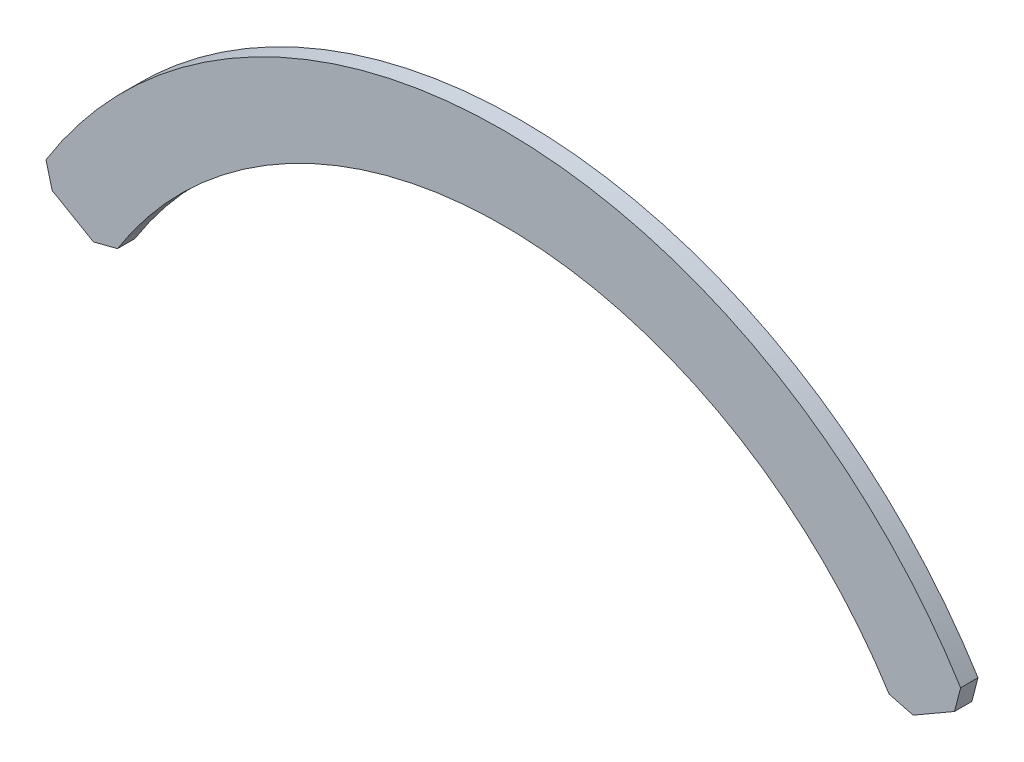
ISO-10303-21;
HEADER;
FILE_DESCRIPTION(('STEP AP214'),'2;1');
FILE_NAME('part.step','',(''),(''),'','','');
FILE_SCHEMA(('AUTOMOTIVE_DESIGN { 1 0 10303 214 1 1 1 1 }'));
ENDSEC;
DATA;
#1=APPLICATION_CONTEXT('core data for automotive mechanical design processes');
#2=APPLICATION_PROTOCOL_DEFINITION('international standard','automotive_design',2000,#1);
#3=PRODUCT_CONTEXT('',#1,'mechanical');
#4=PRODUCT('Part','Part','',(#3));
#5=PRODUCT_RELATED_PRODUCT_CATEGORY('part','',(#4));
#6=PRODUCT_DEFINITION_FORMATION('','',#4);
#7=PRODUCT_DEFINITION_CONTEXT('part definition',#1,'design');
#8=PRODUCT_DEFINITION('design','',#6,#7);
#9=PRODUCT_DEFINITION_SHAPE('','',#8);
#10=(LENGTH_UNIT() NAMED_UNIT(*) SI_UNIT(.MILLI.,.METRE.));
#11=(NAMED_UNIT(*) PLANE_ANGLE_UNIT() SI_UNIT($,.RADIAN.));
#12=(NAMED_UNIT(*) SI_UNIT($,.STERADIAN.) SOLID_ANGLE_UNIT());
#13=UNCERTAINTY_MEASURE_WITH_UNIT(LENGTH_MEASURE(1.E-05),#10,'distance_accuracy_value','');
#14=(GEOMETRIC_REPRESENTATION_CONTEXT(3) GLOBAL_UNCERTAINTY_ASSIGNED_CONTEXT((#13)) GLOBAL_UNIT_ASSIGNED_CONTEXT((#10,
#11,#12)) REPRESENTATION_CONTEXT('',''));
#15=CARTESIAN_POINT('',(0.,0.,0.));
#16=DIRECTION('',(0.,0.,1.));
#17=DIRECTION('',(1.,0.,0.));
#18=AXIS2_PLACEMENT_3D('',#15,#16,#17);
#19=CARTESIAN_POINT('',(0.,45.8514900476783,0.));
#20=DIRECTION('',(0.,0.,1.));
#21=DIRECTION('',(1.,0.,0.));
#22=AXIS2_PLACEMENT_3D('',#19,#20,#21);
#23=PLANE('',#22);
#24=DIRECTION('',(0.251020650343816,0.967981731801261,0.));
#25=VECTOR('',#24,1.);
#26=CARTESIAN_POINT('',(52.4263265434366,31.7923631005223,0.));
#27=LINE('',#26,#25);
#28=CARTESIAN_POINT('',(51.9615242270663,30.,0.));
#29=VERTEX_POINT('',#28);
#30=CARTESIAN_POINT('',(52.6657688125887,32.7156964678878,0.));
#31=VERTEX_POINT('',#30);
#32=EDGE_CURVE('E141',#29,#31,#27,.T.);
#33=ORIENTED_EDGE('',*,*,#32,.F.);
#34=DIRECTION('',(0.866025403784438,0.5,0.));
#35=VECTOR('',#34,1.);
#36=CARTESIAN_POINT('',(45.466333698683,26.25,0.));
#37=LINE('',#36,#35);
#38=CARTESIAN_POINT('',(47.1983845062519,27.25,0.));
#39=VERTEX_POINT('',#38);
#40=EDGE_CURVE('E121',#39,#29,#37,.T.);
#41=ORIENTED_EDGE('',*,*,#40,.F.);
#42=DIRECTION('',(0.968347070254766,-0.249607595094804,0.));
#43=VECTOR('',#42,1.);
#44=CARTESIAN_POINT('',(22.1302468129428,33.7117302569894,0.));
#45=LINE('',#44,#43);
#46=CARTESIAN_POINT('',(44.4335236770821,27.9626889557887,0.));
#47=VERTEX_POINT('',#46);
#48=EDGE_CURVE('E148',#47,#39,#45,.T.);
#49=ORIENTED_EDGE('',*,*,#48,.F.);
#50=CARTESIAN_POINT('',(0.,0.,0.));
#51=DIRECTION('',(0.,0.,-1.));
#52=DIRECTION('',(-0.866025403784439,-0.5,0.));
#53=AXIS2_PLACEMENT_3D('',#50,#51,#52);
#54=CIRCLE('',#53,52.5);
#55=CARTESIAN_POINT('',(-44.4335236770821,27.9626889557887,0.));
#56=VERTEX_POINT('',#55);
#57=EDGE_CURVE('E133',#56,#47,#54,.T.);
#58=ORIENTED_EDGE('',*,*,#57,.F.);
#59=DIRECTION('',(0.968347070254765,0.249607595094807,0.));
#60=VECTOR('',#59,1.);
#61=CARTESIAN_POINT('',(-22.1302468129428,33.7117302569895,0.));
#62=LINE('',#61,#60);
#63=CARTESIAN_POINT('',(-47.1983845062519,27.25,0.));
#64=VERTEX_POINT('',#63);
#65=EDGE_CURVE('E168',#64,#56,#62,.T.);
#66=ORIENTED_EDGE('',*,*,#65,.F.);
#67=DIRECTION('',(0.866025403784438,-0.5,0.));
#68=VECTOR('',#67,1.);
#69=CARTESIAN_POINT('',(-53.6935750346352,31.,0.));
#70=LINE('',#69,#68);
#71=CARTESIAN_POINT('',(-51.9615242270663,30.,0.));
#72=VERTEX_POINT('',#71);
#73=EDGE_CURVE('E104',#72,#64,#70,.T.);
#74=ORIENTED_EDGE('',*,*,#73,.F.);
#75=DIRECTION('',(0.251020650343815,-0.967981731801261,0.));
#76=VECTOR('',#75,1.);
#77=CARTESIAN_POINT('',(-52.4263265434366,31.7923631005224,0.));
#78=LINE('',#77,#76);
#79=CARTESIAN_POINT('',(-52.6657688125887,32.7156964678878,0.));
#80=VERTEX_POINT('',#79);
#81=EDGE_CURVE('E28',#80,#72,#78,.T.);
#82=ORIENTED_EDGE('',*,*,#81,.F.);
#83=CARTESIAN_POINT('',(0.,0.,0.));
#84=DIRECTION('',(0.,0.,1.));
#85=DIRECTION('',(0.866025403784439,0.5,0.));
#86=AXIS2_PLACEMENT_3D('',#83,#84,#85);
#87=CIRCLE('',#86,62.);
#88=EDGE_CURVE('E11',#31,#80,#87,.T.);
#89=ORIENTED_EDGE('',*,*,#88,.F.);
#90=EDGE_LOOP('',(#33,#41,#49,#58,#66,#74,#82,#89));
#91=FACE_BOUND('',#90,.T.);
#92=ADVANCED_FACE('F17',(#91),#23,.F.);
#93=CARTESIAN_POINT('',(0.,0.,0.));
#94=DIRECTION('',(0.,0.,1.));
#95=DIRECTION('',(0.866025403784439,0.5,0.));
#96=AXIS2_PLACEMENT_3D('',#93,#94,#95);
#97=CYLINDRICAL_SURFACE('',#96,62.);
#98=DIRECTION('',(0.,0.,1.));
#99=VECTOR('',#98,1.);
#100=CARTESIAN_POINT('',(52.6657688125887,32.7156964678878,0.));
#101=LINE('',#100,#99);
#102=CARTESIAN_POINT('',(52.6657688125887,32.7156964678878,2.));
#103=VERTEX_POINT('',#102);
#104=EDGE_CURVE('E138',#31,#103,#101,.T.);
#105=ORIENTED_EDGE('',*,*,#104,.F.);
#106=ORIENTED_EDGE('',*,*,#88,.T.);
#107=DIRECTION('',(0.,0.,-1.));
#108=VECTOR('',#107,1.);
#109=CARTESIAN_POINT('',(-52.6657688125887,32.7156964678878,0.));
#110=LINE('',#109,#108);
#111=CARTESIAN_POINT('',(-52.6657688125887,32.7156964678878,2.));
#112=VERTEX_POINT('',#111);
#113=EDGE_CURVE('E96',#112,#80,#110,.T.);
#114=ORIENTED_EDGE('',*,*,#113,.F.);
#115=CARTESIAN_POINT('',(0.,0.,2.));
#116=DIRECTION('',(0.,0.,1.));
#117=DIRECTION('',(0.866025403784439,0.5,0.));
#118=AXIS2_PLACEMENT_3D('',#115,#116,#117);
#119=CIRCLE('',#118,62.);
#120=EDGE_CURVE('E100',#103,#112,#119,.T.);
#121=ORIENTED_EDGE('',*,*,#120,.F.);
#122=EDGE_LOOP('',(#105,#106,#114,#121));
#123=FACE_BOUND('',#122,.T.);
#124=ADVANCED_FACE('F98',(#123),#97,.T.);
#125=CARTESIAN_POINT('',(-52.3136465198275,31.3578482339439,0.));
#126=DIRECTION('',(-0.967981731801261,-0.251020650343815,0.));
#127=DIRECTION('',(-0.251020650343815,0.967981731801261,0.));
#128=AXIS2_PLACEMENT_3D('',#125,#126,#127);
#129=PLANE('',#128);
#130=DIRECTION('',(-0.251020650343815,0.967981731801261,0.));
#131=VECTOR('',#130,1.);
#132=CARTESIAN_POINT('',(-52.4263265434366,31.7923631005224,2.));
#133=LINE('',#132,#131);
#134=CARTESIAN_POINT('',(-51.9615242270663,30.,2.));
#135=VERTEX_POINT('',#134);
#136=EDGE_CURVE('E107',#135,#112,#133,.T.);
#137=ORIENTED_EDGE('',*,*,#136,.T.);
#138=ORIENTED_EDGE('',*,*,#113,.T.);
#139=ORIENTED_EDGE('',*,*,#81,.T.);
#140=DIRECTION('',(0.,0.,1.));
#141=VECTOR('',#140,1.);
#142=CARTESIAN_POINT('',(-51.9615242270663,30.,0.));
#143=LINE('',#142,#141);
#144=EDGE_CURVE('E21',#72,#135,#143,.T.);
#145=ORIENTED_EDGE('',*,*,#144,.T.);
#146=EDGE_LOOP('',(#137,#138,#139,#145));
#147=FACE_BOUND('',#146,.T.);
#148=ADVANCED_FACE('F108',(#147),#129,.T.);
#149=CARTESIAN_POINT('',(-53.6935750346352,31.,0.));
#150=DIRECTION('',(-0.5,-0.866025403784438,0.));
#151=DIRECTION('',(-0.866025403784438,0.5,0.));
#152=AXIS2_PLACEMENT_3D('',#149,#150,#151);
#153=PLANE('',#152);
#154=DIRECTION('',(0.,0.,-1.));
#155=VECTOR('',#154,1.);
#156=CARTESIAN_POINT('',(-47.1983845062519,27.25,0.));
#157=LINE('',#156,#155);
#158=CARTESIAN_POINT('',(-47.1983845062519,27.25,2.));
#159=VERTEX_POINT('',#158);
#160=EDGE_CURVE('E136',#159,#64,#157,.T.);
#161=ORIENTED_EDGE('',*,*,#160,.F.);
#162=DIRECTION('',(0.866025403784438,-0.5,0.));
#163=VECTOR('',#162,1.);
#164=CARTESIAN_POINT('',(-53.6935750346352,31.,2.));
#165=LINE('',#164,#163);
#166=EDGE_CURVE('E114',#135,#159,#165,.T.);
#167=ORIENTED_EDGE('',*,*,#166,.F.);
#168=ORIENTED_EDGE('',*,*,#144,.F.);
#169=ORIENTED_EDGE('',*,*,#73,.T.);
#170=EDGE_LOOP('',(#161,#167,#168,#169));
#171=FACE_BOUND('',#170,.T.);
#172=ADVANCED_FACE('F162',(#171),#153,.T.);
#173=CARTESIAN_POINT('',(-45.815954091667,27.6063444778944,0.));
#174=DIRECTION('',(0.249607595094807,-0.968347070254765,0.));
#175=DIRECTION('',(0.,0.,-1.));
#176=AXIS2_PLACEMENT_3D('',#173,#174,#175);
#177=PLANE('',#176);
#178=DIRECTION('',(-0.968347070254765,-0.249607595094807,0.));
#179=VECTOR('',#178,1.);
#180=CARTESIAN_POINT('',(-22.1302468129428,33.7117302569895,2.));
#181=LINE('',#180,#179);
#182=CARTESIAN_POINT('',(-44.4335236770821,27.9626889557887,2.));
#183=VERTEX_POINT('',#182);
#184=EDGE_CURVE('E150',#183,#159,#181,.T.);
#185=ORIENTED_EDGE('',*,*,#184,.T.);
#186=ORIENTED_EDGE('',*,*,#160,.T.);
#187=ORIENTED_EDGE('',*,*,#65,.T.);
#188=DIRECTION('',(0.,0.,1.));
#189=VECTOR('',#188,1.);
#190=CARTESIAN_POINT('',(-44.4335236770821,27.9626889557887,0.));
#191=LINE('',#190,#189);
#192=EDGE_CURVE('E137',#56,#183,#191,.T.);
#193=ORIENTED_EDGE('',*,*,#192,.T.);
#194=EDGE_LOOP('',(#185,#186,#187,#193));
#195=FACE_BOUND('',#194,.T.);
#196=ADVANCED_FACE('F171',(#195),#177,.T.);
#197=CARTESIAN_POINT('',(0.,0.,0.));
#198=DIRECTION('',(0.,0.,1.));
#199=DIRECTION('',(-0.866025403784439,-0.5,0.));
#200=AXIS2_PLACEMENT_3D('',#197,#198,#199);
#201=CYLINDRICAL_SURFACE('',#200,52.5);
#202=DIRECTION('',(0.,0.,-1.));
#203=VECTOR('',#202,1.);
#204=CARTESIAN_POINT('',(44.4335236770821,27.9626889557887,0.));
#205=LINE('',#204,#203);
#206=CARTESIAN_POINT('',(44.4335236770821,27.9626889557887,2.));
#207=VERTEX_POINT('',#206);
#208=EDGE_CURVE('E144',#207,#47,#205,.T.);
#209=ORIENTED_EDGE('',*,*,#208,.F.);
#210=CARTESIAN_POINT('',(0.,0.,2.));
#211=DIRECTION('',(0.,0.,-1.));
#212=DIRECTION('',(-0.866025403784439,-0.5,0.));
#213=AXIS2_PLACEMENT_3D('',#210,#211,#212);
#214=CIRCLE('',#213,52.5);
#215=EDGE_CURVE('E154',#183,#207,#214,.T.);
#216=ORIENTED_EDGE('',*,*,#215,.F.);
#217=ORIENTED_EDGE('',*,*,#192,.F.);
#218=ORIENTED_EDGE('',*,*,#57,.T.);
#219=EDGE_LOOP('',(#209,#216,#217,#218));
#220=FACE_BOUND('',#219,.T.);
#221=ADVANCED_FACE('F177',(#220),#201,.F.);
#222=CARTESIAN_POINT('',(45.815954091667,27.6063444778944,0.));
#223=DIRECTION('',(-0.249607595094804,-0.968347070254766,0.));
#224=DIRECTION('',(-0.968347070254766,0.249607595094804,0.));
#225=AXIS2_PLACEMENT_3D('',#222,#223,#224);
#226=PLANE('',#225);
#227=DIRECTION('',(-0.968347070254766,0.249607595094804,0.));
#228=VECTOR('',#227,1.);
#229=CARTESIAN_POINT('',(22.1302468129428,33.7117302569894,2.));
#230=LINE('',#229,#228);
#231=CARTESIAN_POINT('',(47.1983845062519,27.25,2.));
#232=VERTEX_POINT('',#231);
#233=EDGE_CURVE('E149',#232,#207,#230,.T.);
#234=ORIENTED_EDGE('',*,*,#233,.T.);
#235=ORIENTED_EDGE('',*,*,#208,.T.);
#236=ORIENTED_EDGE('',*,*,#48,.T.);
#237=DIRECTION('',(0.,0.,1.));
#238=VECTOR('',#237,1.);
#239=CARTESIAN_POINT('',(47.1983845062519,27.25,0.));
#240=LINE('',#239,#238);
#241=EDGE_CURVE('E127',#39,#232,#240,.T.);
#242=ORIENTED_EDGE('',*,*,#241,.T.);
#243=EDGE_LOOP('',(#234,#235,#236,#242));
#244=FACE_BOUND('',#243,.T.);
#245=ADVANCED_FACE('F257',(#244),#226,.T.);
#246=CARTESIAN_POINT('',(0.,45.8514900476783,2.));
#247=DIRECTION('',(0.,0.,1.));
#248=DIRECTION('',(1.,0.,0.));
#249=AXIS2_PLACEMENT_3D('',#246,#247,#248);
#250=PLANE('',#249);
#251=DIRECTION('',(-0.251020650343816,-0.967981731801261,0.));
#252=VECTOR('',#251,1.);
#253=CARTESIAN_POINT('',(52.4263265434366,31.7923631005223,2.));
#254=LINE('',#253,#252);
#255=CARTESIAN_POINT('',(51.9615242270663,30.,2.));
#256=VERTEX_POINT('',#255);
#257=EDGE_CURVE('E119',#103,#256,#254,.T.);
#258=ORIENTED_EDGE('',*,*,#257,.F.);
#259=ORIENTED_EDGE('',*,*,#120,.T.);
#260=ORIENTED_EDGE('',*,*,#136,.F.);
#261=ORIENTED_EDGE('',*,*,#166,.T.);
#262=ORIENTED_EDGE('',*,*,#184,.F.);
#263=ORIENTED_EDGE('',*,*,#215,.T.);
#264=ORIENTED_EDGE('',*,*,#233,.F.);
#265=DIRECTION('',(0.866025403784438,0.5,0.));
#266=VECTOR('',#265,1.);
#267=CARTESIAN_POINT('',(45.466333698683,26.25,2.));
#268=LINE('',#267,#266);
#269=EDGE_CURVE('E131',#232,#256,#268,.T.);
#270=ORIENTED_EDGE('',*,*,#269,.T.);
#271=EDGE_LOOP('',(#258,#259,#260,#261,#262,#263,#264,#270));
#272=FACE_BOUND('',#271,.T.);
#273=ADVANCED_FACE('F117',(#272),#250,.T.);
#274=CARTESIAN_POINT('',(45.466333698683,26.25,0.));
#275=DIRECTION('',(0.5,-0.866025403784438,0.));
#276=DIRECTION('',(0.,0.,-1.));
#277=AXIS2_PLACEMENT_3D('',#274,#275,#276);
#278=PLANE('',#277);
#279=DIRECTION('',(0.,0.,-1.));
#280=VECTOR('',#279,1.);
#281=CARTESIAN_POINT('',(51.9615242270663,30.,0.));
#282=LINE('',#281,#280);
#283=EDGE_CURVE('E189',#256,#29,#282,.T.);
#284=ORIENTED_EDGE('',*,*,#283,.F.);
#285=ORIENTED_EDGE('',*,*,#269,.F.);
#286=ORIENTED_EDGE('',*,*,#241,.F.);
#287=ORIENTED_EDGE('',*,*,#40,.T.);
#288=EDGE_LOOP('',(#284,#285,#286,#287));
#289=FACE_BOUND('',#288,.T.);
#290=ADVANCED_FACE('F233',(#289),#278,.T.);
#291=CARTESIAN_POINT('',(52.3136465198275,31.3578482339439,0.));
#292=DIRECTION('',(0.967981731801261,-0.251020650343816,0.));
#293=DIRECTION('',(0.,0.,-1.));
#294=AXIS2_PLACEMENT_3D('',#291,#292,#293);
#295=PLANE('',#294);
#296=ORIENTED_EDGE('',*,*,#257,.T.);
#297=ORIENTED_EDGE('',*,*,#283,.T.);
#298=ORIENTED_EDGE('',*,*,#32,.T.);
#299=ORIENTED_EDGE('',*,*,#104,.T.);
#300=EDGE_LOOP('',(#296,#297,#298,#299));
#301=FACE_BOUND('',#300,.T.);
#302=ADVANCED_FACE('F19',(#301),#295,.T.);
#303=CLOSED_SHELL('',(#92,#124,#148,#172,#196,#221,#245,#273,#290,#302));
#304=MANIFOLD_SOLID_BREP('B1',#303);
#305=ADVANCED_BREP_SHAPE_REPRESENTATION('',(#18,#304),#14);
#306=SHAPE_DEFINITION_REPRESENTATION(#9,#305);
ENDSEC;
END-ISO-10303-21;
